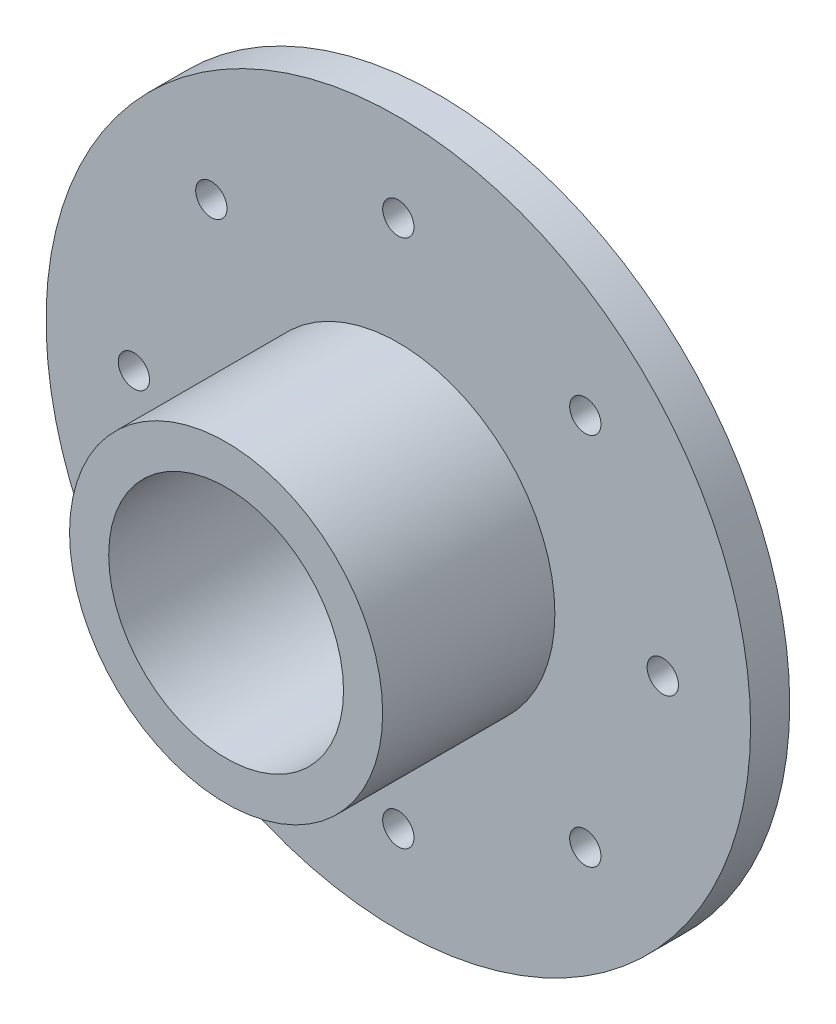
ISO-10303-21;
HEADER;
FILE_DESCRIPTION(('STEP AP214'),'2;1');
FILE_NAME('part.step','',(''),(''),'','','');
FILE_SCHEMA(('AUTOMOTIVE_DESIGN { 1 0 10303 214 1 1 1 1 }'));
ENDSEC;
DATA;
#1=APPLICATION_CONTEXT('core data for automotive mechanical design processes');
#2=APPLICATION_PROTOCOL_DEFINITION('international standard','automotive_design',2000,#1);
#3=PRODUCT_CONTEXT('',#1,'mechanical');
#4=PRODUCT('Part','Part','',(#3));
#5=PRODUCT_RELATED_PRODUCT_CATEGORY('part','',(#4));
#6=PRODUCT_DEFINITION_FORMATION('','',#4);
#7=PRODUCT_DEFINITION_CONTEXT('part definition',#1,'design');
#8=PRODUCT_DEFINITION('design','',#6,#7);
#9=PRODUCT_DEFINITION_SHAPE('','',#8);
#10=(LENGTH_UNIT() NAMED_UNIT(*) SI_UNIT(.MILLI.,.METRE.));
#11=(NAMED_UNIT(*) PLANE_ANGLE_UNIT() SI_UNIT($,.RADIAN.));
#12=(NAMED_UNIT(*) SI_UNIT($,.STERADIAN.) SOLID_ANGLE_UNIT());
#13=UNCERTAINTY_MEASURE_WITH_UNIT(LENGTH_MEASURE(1.E-05),#10,'distance_accuracy_value','');
#14=(GEOMETRIC_REPRESENTATION_CONTEXT(3) GLOBAL_UNCERTAINTY_ASSIGNED_CONTEXT((#13)) GLOBAL_UNIT_ASSIGNED_CONTEXT((#10,
#11,#12)) REPRESENTATION_CONTEXT('',''));
#15=CARTESIAN_POINT('',(0.,0.,0.));
#16=DIRECTION('',(0.,0.,1.));
#17=DIRECTION('',(1.,0.,0.));
#18=AXIS2_PLACEMENT_3D('',#15,#16,#17);
#19=CARTESIAN_POINT('',(0.,0.,5.));
#20=DIRECTION('',(0.,0.,1.));
#21=DIRECTION('',(1.,0.,0.));
#22=AXIS2_PLACEMENT_3D('',#19,#20,#21);
#23=PLANE('',#22);
#24=CARTESIAN_POINT('',(-23.8868809179867,23.8868809179867,5.));
#25=DIRECTION('',(0.,0.,1.));
#26=DIRECTION('',(1.,0.,0.));
#27=AXIS2_PLACEMENT_3D('',#24,#25,#26);
#28=CIRCLE('',#27,2.);
#29=CARTESIAN_POINT('',(-21.8868809179867,23.8868809179867,5.));
#30=VERTEX_POINT('',#29);
#31=EDGE_CURVE('E98',#30,#30,#28,.T.);
#32=ORIENTED_EDGE('',*,*,#31,.F.);
#33=EDGE_LOOP('',(#32));
#34=FACE_BOUND('',#33,.T.);
#35=CARTESIAN_POINT('',(-33.7811509570078,0.,5.));
#36=DIRECTION('',(0.,0.,1.));
#37=DIRECTION('',(1.,0.,0.));
#38=AXIS2_PLACEMENT_3D('',#35,#36,#37);
#39=CIRCLE('',#38,2.);
#40=CARTESIAN_POINT('',(-31.7811509570078,0.,5.));
#41=VERTEX_POINT('',#40);
#42=EDGE_CURVE('E92',#41,#41,#39,.T.);
#43=ORIENTED_EDGE('',*,*,#42,.F.);
#44=EDGE_LOOP('',(#43));
#45=FACE_BOUND('',#44,.T.);
#46=CARTESIAN_POINT('',(-23.8868809179867,-23.8868809179867,5.));
#47=DIRECTION('',(0.,0.,1.));
#48=DIRECTION('',(1.,0.,0.));
#49=AXIS2_PLACEMENT_3D('',#46,#47,#48);
#50=CIRCLE('',#49,2.);
#51=CARTESIAN_POINT('',(-21.8868809179867,-23.8868809179867,5.));
#52=VERTEX_POINT('',#51);
#53=EDGE_CURVE('E86',#52,#52,#50,.T.);
#54=ORIENTED_EDGE('',*,*,#53,.F.);
#55=EDGE_LOOP('',(#54));
#56=FACE_BOUND('',#55,.T.);
#57=CARTESIAN_POINT('',(0.,-33.7811509570078,5.));
#58=DIRECTION('',(0.,0.,1.));
#59=DIRECTION('',(1.,0.,0.));
#60=AXIS2_PLACEMENT_3D('',#57,#58,#59);
#61=CIRCLE('',#60,2.);
#62=CARTESIAN_POINT('',(2.00000000000001,-33.7811509570078,5.));
#63=VERTEX_POINT('',#62);
#64=EDGE_CURVE('E80',#63,#63,#61,.T.);
#65=ORIENTED_EDGE('',*,*,#64,.F.);
#66=EDGE_LOOP('',(#65));
#67=FACE_BOUND('',#66,.T.);
#68=CARTESIAN_POINT('',(23.8868809179867,-23.8868809179867,5.));
#69=DIRECTION('',(0.,0.,1.));
#70=DIRECTION('',(1.,0.,0.));
#71=AXIS2_PLACEMENT_3D('',#68,#69,#70);
#72=CIRCLE('',#71,2.);
#73=CARTESIAN_POINT('',(25.8868809179867,-23.8868809179867,5.));
#74=VERTEX_POINT('',#73);
#75=EDGE_CURVE('E74',#74,#74,#72,.T.);
#76=ORIENTED_EDGE('',*,*,#75,.F.);
#77=EDGE_LOOP('',(#76));
#78=FACE_BOUND('',#77,.T.);
#79=CARTESIAN_POINT('',(33.7811509570078,0.,5.));
#80=DIRECTION('',(0.,0.,1.));
#81=DIRECTION('',(1.,0.,0.));
#82=AXIS2_PLACEMENT_3D('',#79,#80,#81);
#83=CIRCLE('',#82,2.);
#84=CARTESIAN_POINT('',(35.7811509570078,0.,5.));
#85=VERTEX_POINT('',#84);
#86=EDGE_CURVE('E68',#85,#85,#83,.T.);
#87=ORIENTED_EDGE('',*,*,#86,.F.);
#88=EDGE_LOOP('',(#87));
#89=FACE_BOUND('',#88,.T.);
#90=CARTESIAN_POINT('',(23.8868809179867,23.8868809179867,5.));
#91=DIRECTION('',(0.,0.,1.));
#92=DIRECTION('',(1.,0.,0.));
#93=AXIS2_PLACEMENT_3D('',#90,#91,#92);
#94=CIRCLE('',#93,2.);
#95=CARTESIAN_POINT('',(25.8868809179867,23.8868809179867,5.));
#96=VERTEX_POINT('',#95);
#97=EDGE_CURVE('E62',#96,#96,#94,.T.);
#98=ORIENTED_EDGE('',*,*,#97,.F.);
#99=EDGE_LOOP('',(#98));
#100=FACE_BOUND('',#99,.T.);
#101=CARTESIAN_POINT('',(0.,33.7811509570078,5.));
#102=DIRECTION('',(0.,0.,1.));
#103=DIRECTION('',(1.,0.,0.));
#104=AXIS2_PLACEMENT_3D('',#101,#102,#103);
#105=CIRCLE('',#104,2.);
#106=CARTESIAN_POINT('',(2.,33.7811509570078,5.));
#107=VERTEX_POINT('',#106);
#108=EDGE_CURVE('E56',#107,#107,#105,.T.);
#109=ORIENTED_EDGE('',*,*,#108,.F.);
#110=EDGE_LOOP('',(#109));
#111=FACE_BOUND('',#110,.T.);
#112=CARTESIAN_POINT('',(0.,0.,5.));
#113=DIRECTION('',(0.,0.,1.));
#114=DIRECTION('',(1.,0.,0.));
#115=AXIS2_PLACEMENT_3D('',#112,#113,#114);
#116=CIRCLE('',#115,45.);
#117=CARTESIAN_POINT('',(45.,0.,5.));
#118=VERTEX_POINT('',#117);
#119=EDGE_CURVE('E36',#118,#118,#116,.T.);
#120=ORIENTED_EDGE('',*,*,#119,.T.);
#121=EDGE_LOOP('',(#120));
#122=FACE_BOUND('',#121,.T.);
#123=CARTESIAN_POINT('',(0.,0.,5.));
#124=DIRECTION('',(0.,0.,1.));
#125=DIRECTION('',(1.,0.,0.));
#126=AXIS2_PLACEMENT_3D('',#123,#124,#125);
#127=CIRCLE('',#126,20.);
#128=CARTESIAN_POINT('',(20.,0.,5.));
#129=VERTEX_POINT('',#128);
#130=EDGE_CURVE('E47',#129,#129,#127,.T.);
#131=ORIENTED_EDGE('',*,*,#130,.F.);
#132=EDGE_LOOP('',(#131));
#133=FACE_BOUND('',#132,.T.);
#134=ADVANCED_FACE('F29',(#34,#45,#56,#67,#78,#89,#100,#111,#122,#133),#23,.T.);
#135=CARTESIAN_POINT('',(0.,0.,5.));
#136=DIRECTION('',(0.,0.,-1.));
#137=DIRECTION('',(-1.,0.,0.));
#138=AXIS2_PLACEMENT_3D('',#135,#136,#137);
#139=CYLINDRICAL_SURFACE('',#138,45.);
#140=ORIENTED_EDGE('',*,*,#119,.F.);
#141=EDGE_LOOP('',(#140));
#142=FACE_BOUND('',#141,.T.);
#143=CARTESIAN_POINT('',(0.,0.,0.));
#144=DIRECTION('',(0.,0.,1.));
#145=DIRECTION('',(1.,0.,0.));
#146=AXIS2_PLACEMENT_3D('',#143,#144,#145);
#147=CIRCLE('',#146,45.);
#148=CARTESIAN_POINT('',(45.,0.,0.));
#149=VERTEX_POINT('',#148);
#150=EDGE_CURVE('E40',#149,#149,#147,.T.);
#151=ORIENTED_EDGE('',*,*,#150,.T.);
#152=EDGE_LOOP('',(#151));
#153=FACE_BOUND('',#152,.T.);
#154=ADVANCED_FACE('F31',(#142,#153),#139,.T.);
#155=CARTESIAN_POINT('',(0.,0.,0.));
#156=DIRECTION('',(0.,0.,1.));
#157=DIRECTION('',(1.,0.,0.));
#158=AXIS2_PLACEMENT_3D('',#155,#156,#157);
#159=PLANE('',#158);
#160=CARTESIAN_POINT('',(-23.8868809179867,23.8868809179867,0.));
#161=DIRECTION('',(0.,0.,1.));
#162=DIRECTION('',(1.,0.,0.));
#163=AXIS2_PLACEMENT_3D('',#160,#161,#162);
#164=CIRCLE('',#163,2.);
#165=CARTESIAN_POINT('',(-21.8868809179867,23.8868809179867,0.));
#166=VERTEX_POINT('',#165);
#167=EDGE_CURVE('E95',#166,#166,#164,.T.);
#168=ORIENTED_EDGE('',*,*,#167,.T.);
#169=EDGE_LOOP('',(#168));
#170=FACE_BOUND('',#169,.T.);
#171=CARTESIAN_POINT('',(-33.7811509570078,0.,0.));
#172=DIRECTION('',(0.,0.,1.));
#173=DIRECTION('',(1.,0.,0.));
#174=AXIS2_PLACEMENT_3D('',#171,#172,#173);
#175=CIRCLE('',#174,2.);
#176=CARTESIAN_POINT('',(-31.7811509570078,0.,0.));
#177=VERTEX_POINT('',#176);
#178=EDGE_CURVE('E89',#177,#177,#175,.T.);
#179=ORIENTED_EDGE('',*,*,#178,.T.);
#180=EDGE_LOOP('',(#179));
#181=FACE_BOUND('',#180,.T.);
#182=CARTESIAN_POINT('',(-23.8868809179867,-23.8868809179867,0.));
#183=DIRECTION('',(0.,0.,1.));
#184=DIRECTION('',(1.,0.,0.));
#185=AXIS2_PLACEMENT_3D('',#182,#183,#184);
#186=CIRCLE('',#185,2.);
#187=CARTESIAN_POINT('',(-21.8868809179867,-23.8868809179867,0.));
#188=VERTEX_POINT('',#187);
#189=EDGE_CURVE('E83',#188,#188,#186,.T.);
#190=ORIENTED_EDGE('',*,*,#189,.T.);
#191=EDGE_LOOP('',(#190));
#192=FACE_BOUND('',#191,.T.);
#193=CARTESIAN_POINT('',(0.,-33.7811509570078,0.));
#194=DIRECTION('',(0.,0.,1.));
#195=DIRECTION('',(1.,0.,0.));
#196=AXIS2_PLACEMENT_3D('',#193,#194,#195);
#197=CIRCLE('',#196,2.);
#198=CARTESIAN_POINT('',(2.00000000000001,-33.7811509570078,0.));
#199=VERTEX_POINT('',#198);
#200=EDGE_CURVE('E77',#199,#199,#197,.T.);
#201=ORIENTED_EDGE('',*,*,#200,.T.);
#202=EDGE_LOOP('',(#201));
#203=FACE_BOUND('',#202,.T.);
#204=CARTESIAN_POINT('',(23.8868809179867,-23.8868809179867,0.));
#205=DIRECTION('',(0.,0.,1.));
#206=DIRECTION('',(1.,0.,0.));
#207=AXIS2_PLACEMENT_3D('',#204,#205,#206);
#208=CIRCLE('',#207,2.);
#209=CARTESIAN_POINT('',(25.8868809179867,-23.8868809179867,0.));
#210=VERTEX_POINT('',#209);
#211=EDGE_CURVE('E71',#210,#210,#208,.T.);
#212=ORIENTED_EDGE('',*,*,#211,.T.);
#213=EDGE_LOOP('',(#212));
#214=FACE_BOUND('',#213,.T.);
#215=CARTESIAN_POINT('',(33.7811509570078,0.,0.));
#216=DIRECTION('',(0.,0.,1.));
#217=DIRECTION('',(1.,0.,0.));
#218=AXIS2_PLACEMENT_3D('',#215,#216,#217);
#219=CIRCLE('',#218,2.);
#220=CARTESIAN_POINT('',(35.7811509570078,0.,0.));
#221=VERTEX_POINT('',#220);
#222=EDGE_CURVE('E65',#221,#221,#219,.T.);
#223=ORIENTED_EDGE('',*,*,#222,.T.);
#224=EDGE_LOOP('',(#223));
#225=FACE_BOUND('',#224,.T.);
#226=CARTESIAN_POINT('',(23.8868809179867,23.8868809179867,0.));
#227=DIRECTION('',(0.,0.,1.));
#228=DIRECTION('',(1.,0.,0.));
#229=AXIS2_PLACEMENT_3D('',#226,#227,#228);
#230=CIRCLE('',#229,2.);
#231=CARTESIAN_POINT('',(25.8868809179867,23.8868809179867,0.));
#232=VERTEX_POINT('',#231);
#233=EDGE_CURVE('E59',#232,#232,#230,.T.);
#234=ORIENTED_EDGE('',*,*,#233,.T.);
#235=EDGE_LOOP('',(#234));
#236=FACE_BOUND('',#235,.T.);
#237=CARTESIAN_POINT('',(0.,33.7811509570078,0.));
#238=DIRECTION('',(0.,0.,1.));
#239=DIRECTION('',(1.,0.,0.));
#240=AXIS2_PLACEMENT_3D('',#237,#238,#239);
#241=CIRCLE('',#240,2.);
#242=CARTESIAN_POINT('',(2.,33.7811509570078,0.));
#243=VERTEX_POINT('',#242);
#244=EDGE_CURVE('E55',#243,#243,#241,.T.);
#245=ORIENTED_EDGE('',*,*,#244,.T.);
#246=EDGE_LOOP('',(#245));
#247=FACE_BOUND('',#246,.T.);
#248=ORIENTED_EDGE('',*,*,#150,.F.);
#249=EDGE_LOOP('',(#248));
#250=FACE_BOUND('',#249,.T.);
#251=ADVANCED_FACE('F104',(#170,#181,#192,#203,#214,#225,#236,#247,#250),#159,.F.);
#252=CARTESIAN_POINT('',(0.,0.,27.));
#253=DIRECTION('',(0.,0.,1.));
#254=DIRECTION('',(1.,0.,0.));
#255=AXIS2_PLACEMENT_3D('',#252,#253,#254);
#256=PLANE('',#255);
#257=CARTESIAN_POINT('',(0.,0.,27.));
#258=DIRECTION('',(0.,0.,1.));
#259=DIRECTION('',(1.,0.,0.));
#260=AXIS2_PLACEMENT_3D('',#257,#258,#259);
#261=CIRCLE('',#260,20.);
#262=CARTESIAN_POINT('',(20.,0.,27.));
#263=VERTEX_POINT('',#262);
#264=EDGE_CURVE('E45',#263,#263,#261,.T.);
#265=ORIENTED_EDGE('',*,*,#264,.T.);
#266=EDGE_LOOP('',(#265));
#267=FACE_BOUND('',#266,.T.);
#268=CARTESIAN_POINT('',(0.,0.,27.));
#269=DIRECTION('',(0.,0.,1.));
#270=DIRECTION('',(1.,0.,0.));
#271=AXIS2_PLACEMENT_3D('',#268,#269,#270);
#272=CIRCLE('',#271,15.);
#273=CARTESIAN_POINT('',(15.,0.,27.));
#274=VERTEX_POINT('',#273);
#275=EDGE_CURVE('E50',#274,#274,#272,.T.);
#276=ORIENTED_EDGE('',*,*,#275,.F.);
#277=EDGE_LOOP('',(#276));
#278=FACE_BOUND('',#277,.T.);
#279=ADVANCED_FACE('F137',(#267,#278),#256,.T.);
#280=CARTESIAN_POINT('',(0.,0.,27.));
#281=DIRECTION('',(0.,0.,-1.));
#282=DIRECTION('',(-1.,0.,0.));
#283=AXIS2_PLACEMENT_3D('',#280,#281,#282);
#284=CYLINDRICAL_SURFACE('',#283,20.);
#285=ORIENTED_EDGE('',*,*,#264,.F.);
#286=EDGE_LOOP('',(#285));
#287=FACE_BOUND('',#286,.T.);
#288=ORIENTED_EDGE('',*,*,#130,.T.);
#289=EDGE_LOOP('',(#288));
#290=FACE_BOUND('',#289,.T.);
#291=ADVANCED_FACE('F134',(#287,#290),#284,.T.);
#292=CARTESIAN_POINT('',(0.,0.,27.));
#293=DIRECTION('',(0.,0.,-1.));
#294=DIRECTION('',(-1.,0.,0.));
#295=AXIS2_PLACEMENT_3D('',#292,#293,#294);
#296=CYLINDRICAL_SURFACE('',#295,15.);
#297=ORIENTED_EDGE('',*,*,#275,.T.);
#298=EDGE_LOOP('',(#297));
#299=FACE_BOUND('',#298,.T.);
#300=CARTESIAN_POINT('',(0.,0.,5.));
#301=DIRECTION('',(0.,0.,1.));
#302=DIRECTION('',(1.,0.,0.));
#303=AXIS2_PLACEMENT_3D('',#300,#301,#302);
#304=CIRCLE('',#303,15.);
#305=CARTESIAN_POINT('',(15.,0.,5.));
#306=VERTEX_POINT('',#305);
#307=EDGE_CURVE('E10',#306,#306,#304,.F.);
#308=ORIENTED_EDGE('',*,*,#307,.T.);
#309=EDGE_LOOP('',(#308));
#310=FACE_BOUND('',#309,.T.);
#311=ADVANCED_FACE('F136',(#299,#310),#296,.F.);
#312=ORIENTED_EDGE('',*,*,#307,.F.);
#313=EDGE_LOOP('',(#312));
#314=FACE_BOUND('',#313,.T.);
#315=ADVANCED_FACE('F117',(#314),#23,.T.);
#316=CARTESIAN_POINT('',(0.,33.7811509570078,0.));
#317=DIRECTION('',(0.,0.,1.));
#318=DIRECTION('',(1.,0.,0.));
#319=AXIS2_PLACEMENT_3D('',#316,#317,#318);
#320=CYLINDRICAL_SURFACE('',#319,2.);
#321=ORIENTED_EDGE('',*,*,#244,.F.);
#322=EDGE_LOOP('',(#321));
#323=FACE_BOUND('',#322,.T.);
#324=ORIENTED_EDGE('',*,*,#108,.T.);
#325=EDGE_LOOP('',(#324));
#326=FACE_BOUND('',#325,.T.);
#327=ADVANCED_FACE('F150',(#323,#326),#320,.F.);
#328=CARTESIAN_POINT('',(23.8868809179867,23.8868809179867,0.));
#329=DIRECTION('',(0.,0.,1.));
#330=DIRECTION('',(1.,0.,0.));
#331=AXIS2_PLACEMENT_3D('',#328,#329,#330);
#332=CYLINDRICAL_SURFACE('',#331,2.);
#333=ORIENTED_EDGE('',*,*,#233,.F.);
#334=EDGE_LOOP('',(#333));
#335=FACE_BOUND('',#334,.T.);
#336=ORIENTED_EDGE('',*,*,#97,.T.);
#337=EDGE_LOOP('',(#336));
#338=FACE_BOUND('',#337,.T.);
#339=ADVANCED_FACE('F185',(#335,#338),#332,.F.);
#340=CARTESIAN_POINT('',(33.7811509570078,0.,0.));
#341=DIRECTION('',(0.,0.,1.));
#342=DIRECTION('',(1.,0.,0.));
#343=AXIS2_PLACEMENT_3D('',#340,#341,#342);
#344=CYLINDRICAL_SURFACE('',#343,2.);
#345=ORIENTED_EDGE('',*,*,#222,.F.);
#346=EDGE_LOOP('',(#345));
#347=FACE_BOUND('',#346,.T.);
#348=ORIENTED_EDGE('',*,*,#86,.T.);
#349=EDGE_LOOP('',(#348));
#350=FACE_BOUND('',#349,.T.);
#351=ADVANCED_FACE('F196',(#347,#350),#344,.F.);
#352=CARTESIAN_POINT('',(23.8868809179867,-23.8868809179867,0.));
#353=DIRECTION('',(0.,0.,1.));
#354=DIRECTION('',(1.,0.,0.));
#355=AXIS2_PLACEMENT_3D('',#352,#353,#354);
#356=CYLINDRICAL_SURFACE('',#355,2.);
#357=ORIENTED_EDGE('',*,*,#211,.F.);
#358=EDGE_LOOP('',(#357));
#359=FACE_BOUND('',#358,.T.);
#360=ORIENTED_EDGE('',*,*,#75,.T.);
#361=EDGE_LOOP('',(#360));
#362=FACE_BOUND('',#361,.T.);
#363=ADVANCED_FACE('F206',(#359,#362),#356,.F.);
#364=CARTESIAN_POINT('',(0.,-33.7811509570078,0.));
#365=DIRECTION('',(0.,0.,1.));
#366=DIRECTION('',(1.,0.,0.));
#367=AXIS2_PLACEMENT_3D('',#364,#365,#366);
#368=CYLINDRICAL_SURFACE('',#367,2.);
#369=ORIENTED_EDGE('',*,*,#200,.F.);
#370=EDGE_LOOP('',(#369));
#371=FACE_BOUND('',#370,.T.);
#372=ORIENTED_EDGE('',*,*,#64,.T.);
#373=EDGE_LOOP('',(#372));
#374=FACE_BOUND('',#373,.T.);
#375=ADVANCED_FACE('F216',(#371,#374),#368,.F.);
#376=CARTESIAN_POINT('',(-23.8868809179867,-23.8868809179867,0.));
#377=DIRECTION('',(0.,0.,1.));
#378=DIRECTION('',(1.,0.,0.));
#379=AXIS2_PLACEMENT_3D('',#376,#377,#378);
#380=CYLINDRICAL_SURFACE('',#379,2.);
#381=ORIENTED_EDGE('',*,*,#189,.F.);
#382=EDGE_LOOP('',(#381));
#383=FACE_BOUND('',#382,.T.);
#384=ORIENTED_EDGE('',*,*,#53,.T.);
#385=EDGE_LOOP('',(#384));
#386=FACE_BOUND('',#385,.T.);
#387=ADVANCED_FACE('F226',(#383,#386),#380,.F.);
#388=CARTESIAN_POINT('',(-33.7811509570078,0.,0.));
#389=DIRECTION('',(0.,0.,1.));
#390=DIRECTION('',(1.,0.,0.));
#391=AXIS2_PLACEMENT_3D('',#388,#389,#390);
#392=CYLINDRICAL_SURFACE('',#391,2.);
#393=ORIENTED_EDGE('',*,*,#178,.F.);
#394=EDGE_LOOP('',(#393));
#395=FACE_BOUND('',#394,.T.);
#396=ORIENTED_EDGE('',*,*,#42,.T.);
#397=EDGE_LOOP('',(#396));
#398=FACE_BOUND('',#397,.T.);
#399=ADVANCED_FACE('F110',(#395,#398),#392,.F.);
#400=CARTESIAN_POINT('',(-23.8868809179867,23.8868809179867,0.));
#401=DIRECTION('',(0.,0.,1.));
#402=DIRECTION('',(1.,0.,0.));
#403=AXIS2_PLACEMENT_3D('',#400,#401,#402);
#404=CYLINDRICAL_SURFACE('',#403,2.);
#405=ORIENTED_EDGE('',*,*,#167,.F.);
#406=EDGE_LOOP('',(#405));
#407=FACE_BOUND('',#406,.T.);
#408=ORIENTED_EDGE('',*,*,#31,.T.);
#409=EDGE_LOOP('',(#408));
#410=FACE_BOUND('',#409,.T.);
#411=ADVANCED_FACE('F107',(#407,#410),#404,.F.);
#412=CLOSED_SHELL('',(#134,#154,#251,#279,#291,#311,#315,#327,#339,#351,#363,#375,#387,#399,#411));
#413=MANIFOLD_SOLID_BREP('B2',#412);
#414=ADVANCED_BREP_SHAPE_REPRESENTATION('',(#18,#413),#14);
#415=SHAPE_DEFINITION_REPRESENTATION(#9,#414);
ENDSEC;
END-ISO-10303-21;
